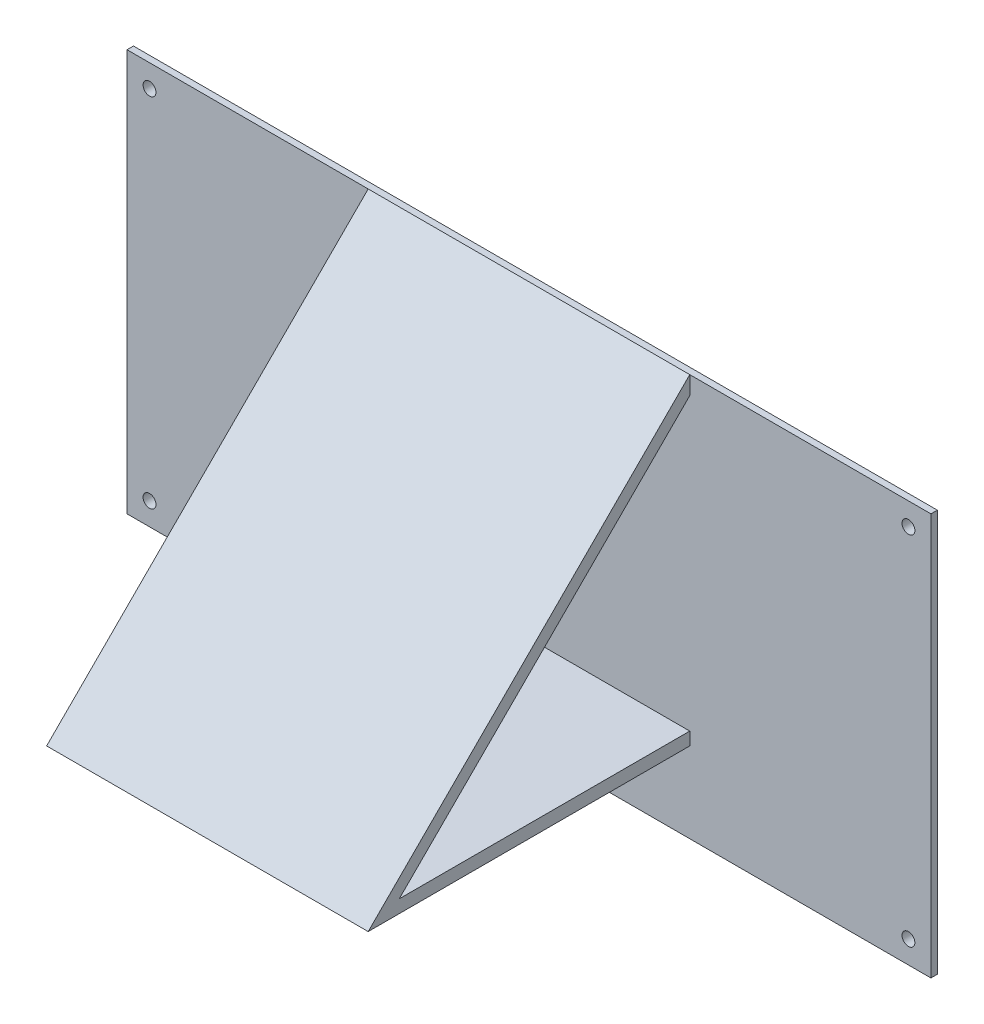
ISO-10303-21;
HEADER;
FILE_DESCRIPTION(('STEP AP214'),'2;1');
FILE_NAME('part.step','',(''),(''),'','','');
FILE_SCHEMA(('AUTOMOTIVE_DESIGN { 1 0 10303 214 1 1 1 1 }'));
ENDSEC;
DATA;
#1=APPLICATION_CONTEXT('core data for automotive mechanical design processes');
#2=APPLICATION_PROTOCOL_DEFINITION('international standard','automotive_design',2000,#1);
#3=PRODUCT_CONTEXT('',#1,'mechanical');
#4=PRODUCT('Part','Part','',(#3));
#5=PRODUCT_RELATED_PRODUCT_CATEGORY('part','',(#4));
#6=PRODUCT_DEFINITION_FORMATION('','',#4);
#7=PRODUCT_DEFINITION_CONTEXT('part definition',#1,'design');
#8=PRODUCT_DEFINITION('design','',#6,#7);
#9=PRODUCT_DEFINITION_SHAPE('','',#8);
#10=(LENGTH_UNIT() NAMED_UNIT(*) SI_UNIT(.MILLI.,.METRE.));
#11=(NAMED_UNIT(*) PLANE_ANGLE_UNIT() SI_UNIT($,.RADIAN.));
#12=(NAMED_UNIT(*) SI_UNIT($,.STERADIAN.) SOLID_ANGLE_UNIT());
#13=UNCERTAINTY_MEASURE_WITH_UNIT(LENGTH_MEASURE(1.E-05),#10,'distance_accuracy_value','');
#14=(GEOMETRIC_REPRESENTATION_CONTEXT(3) GLOBAL_UNCERTAINTY_ASSIGNED_CONTEXT((#13)) GLOBAL_UNIT_ASSIGNED_CONTEXT((#10,
#11,#12)) REPRESENTATION_CONTEXT('',''));
#15=CARTESIAN_POINT('',(0.,0.,0.));
#16=DIRECTION('',(0.,0.,1.));
#17=DIRECTION('',(1.,0.,0.));
#18=AXIS2_PLACEMENT_3D('',#15,#16,#17);
#19=CARTESIAN_POINT('',(75.,125.,102.));
#20=DIRECTION('',(1.,0.,0.));
#21=DIRECTION('',(0.,0.,-1.));
#22=AXIS2_PLACEMENT_3D('',#19,#20,#21);
#23=PLANE('',#22);
#24=DIRECTION('',(0.,0.,-1.));
#25=VECTOR('',#24,1.);
#26=CARTESIAN_POINT('',(75.,29.,92.3431457505076));
#27=LINE('',#26,#25);
#28=CARTESIAN_POINT('',(75.,29.,92.3431457505076));
#29=VERTEX_POINT('',#28);
#30=CARTESIAN_POINT('',(75.,29.,2.));
#31=VERTEX_POINT('',#30);
#32=EDGE_CURVE('E153',#29,#31,#27,.T.);
#33=ORIENTED_EDGE('',*,*,#32,.T.);
#34=DIRECTION('',(0.,-1.,0.));
#35=VECTOR('',#34,1.);
#36=CARTESIAN_POINT('',(75.,125.,2.));
#37=LINE('',#36,#35);
#38=CARTESIAN_POINT('',(75.,25.,2.));
#39=VERTEX_POINT('',#38);
#40=EDGE_CURVE('E182',#31,#39,#37,.T.);
#41=ORIENTED_EDGE('',*,*,#40,.T.);
#42=DIRECTION('',(0.,0.,-1.));
#43=VECTOR('',#42,1.);
#44=CARTESIAN_POINT('',(75.,25.,102.));
#45=LINE('',#44,#43);
#46=CARTESIAN_POINT('',(75.,25.,102.));
#47=VERTEX_POINT('',#46);
#48=EDGE_CURVE('E198',#47,#39,#45,.T.);
#49=ORIENTED_EDGE('',*,*,#48,.F.);
#50=DIRECTION('',(0.,-0.707106781186547,0.707106781186547));
#51=VECTOR('',#50,1.);
#52=CARTESIAN_POINT('',(75.,125.,2.));
#53=LINE('',#52,#51);
#54=CARTESIAN_POINT('',(75.,125.,2.));
#55=VERTEX_POINT('',#54);
#56=EDGE_CURVE('E175',#55,#47,#53,.T.);
#57=ORIENTED_EDGE('',*,*,#56,.F.);
#58=CARTESIAN_POINT('',(75.,119.343145750508,2.));
#59=VERTEX_POINT('',#58);
#60=EDGE_CURVE('E187',#55,#59,#37,.T.);
#61=ORIENTED_EDGE('',*,*,#60,.T.);
#62=DIRECTION('',(0.,-0.707106781186548,0.707106781186547));
#63=VECTOR('',#62,1.);
#64=CARTESIAN_POINT('',(75.,119.343145750508,2.));
#65=LINE('',#64,#63);
#66=EDGE_CURVE('E156',#59,#29,#65,.T.);
#67=ORIENTED_EDGE('',*,*,#66,.T.);
#68=EDGE_LOOP('',(#33,#41,#49,#57,#61,#67));
#69=FACE_BOUND('',#68,.T.);
#70=ADVANCED_FACE('F33',(#69),#23,.F.);
#71=CARTESIAN_POINT('',(175.,125.,102.));
#72=DIRECTION('',(-1.,0.,0.));
#73=DIRECTION('',(0.,0.,1.));
#74=AXIS2_PLACEMENT_3D('',#71,#72,#73);
#75=PLANE('',#74);
#76=DIRECTION('',(0.,0.,-1.));
#77=VECTOR('',#76,1.);
#78=CARTESIAN_POINT('',(175.,29.,92.3431457505076));
#79=LINE('',#78,#77);
#80=CARTESIAN_POINT('',(175.,29.,92.3431457505076));
#81=VERTEX_POINT('',#80);
#82=CARTESIAN_POINT('',(175.,29.,2.));
#83=VERTEX_POINT('',#82);
#84=EDGE_CURVE('E162',#81,#83,#79,.T.);
#85=ORIENTED_EDGE('',*,*,#84,.F.);
#86=DIRECTION('',(0.,-0.707106781186548,0.707106781186547));
#87=VECTOR('',#86,1.);
#88=CARTESIAN_POINT('',(175.,119.343145750508,2.));
#89=LINE('',#88,#87);
#90=CARTESIAN_POINT('',(175.,119.343145750508,1.99999999999999));
#91=VERTEX_POINT('',#90);
#92=EDGE_CURVE('E164',#91,#81,#89,.T.);
#93=ORIENTED_EDGE('',*,*,#92,.F.);
#94=DIRECTION('',(0.,1.,0.));
#95=VECTOR('',#94,1.);
#96=CARTESIAN_POINT('',(175.,125.,2.));
#97=LINE('',#96,#95);
#98=CARTESIAN_POINT('',(175.,125.,2.));
#99=VERTEX_POINT('',#98);
#100=EDGE_CURVE('E193',#91,#99,#97,.T.);
#101=ORIENTED_EDGE('',*,*,#100,.T.);
#102=DIRECTION('',(0.,-0.707106781186547,0.707106781186547));
#103=VECTOR('',#102,1.);
#104=CARTESIAN_POINT('',(175.,125.,2.));
#105=LINE('',#104,#103);
#106=CARTESIAN_POINT('',(175.,25.,102.));
#107=VERTEX_POINT('',#106);
#108=EDGE_CURVE('E176',#99,#107,#105,.T.);
#109=ORIENTED_EDGE('',*,*,#108,.T.);
#110=DIRECTION('',(0.,0.,-1.));
#111=VECTOR('',#110,1.);
#112=CARTESIAN_POINT('',(175.,25.,102.));
#113=LINE('',#112,#111);
#114=CARTESIAN_POINT('',(175.,25.,2.));
#115=VERTEX_POINT('',#114);
#116=EDGE_CURVE('E185',#107,#115,#113,.T.);
#117=ORIENTED_EDGE('',*,*,#116,.T.);
#118=EDGE_CURVE('E186',#115,#83,#97,.T.);
#119=ORIENTED_EDGE('',*,*,#118,.T.);
#120=EDGE_LOOP('',(#85,#93,#101,#109,#117,#119));
#121=FACE_BOUND('',#120,.T.);
#122=ADVANCED_FACE('F261',(#121),#75,.F.);
#123=CARTESIAN_POINT('',(0.,0.,2.));
#124=DIRECTION('',(0.,0.,-1.));
#125=DIRECTION('',(-1.,0.,0.));
#126=AXIS2_PLACEMENT_3D('',#123,#124,#125);
#127=PLANE('',#126);
#128=CARTESIAN_POINT('',(243.,7.00000000000001,2.));
#129=DIRECTION('',(0.,0.,-1.));
#130=DIRECTION('',(-1.,0.,0.));
#131=AXIS2_PLACEMENT_3D('',#128,#129,#130);
#132=CIRCLE('',#131,2.);
#133=CARTESIAN_POINT('',(241.,7.00000000000001,2.));
#134=VERTEX_POINT('',#133);
#135=EDGE_CURVE('E432',#134,#134,#132,.T.);
#136=ORIENTED_EDGE('',*,*,#135,.T.);
#137=EDGE_LOOP('',(#136));
#138=FACE_BOUND('',#137,.T.);
#139=CARTESIAN_POINT('',(6.99999999999998,118.,2.));
#140=DIRECTION('',(0.,0.,-1.));
#141=DIRECTION('',(-1.,0.,0.));
#142=AXIS2_PLACEMENT_3D('',#139,#140,#141);
#143=CIRCLE('',#142,2.);
#144=CARTESIAN_POINT('',(4.99999999999998,118.,2.));
#145=VERTEX_POINT('',#144);
#146=EDGE_CURVE('E433',#145,#145,#143,.T.);
#147=ORIENTED_EDGE('',*,*,#146,.T.);
#148=EDGE_LOOP('',(#147));
#149=FACE_BOUND('',#148,.T.);
#150=CARTESIAN_POINT('',(6.99999999999998,7.,2.));
#151=DIRECTION('',(0.,0.,-1.));
#152=DIRECTION('',(-1.,0.,0.));
#153=AXIS2_PLACEMENT_3D('',#150,#151,#152);
#154=CIRCLE('',#153,2.);
#155=CARTESIAN_POINT('',(4.99999999999998,7.,2.));
#156=VERTEX_POINT('',#155);
#157=EDGE_CURVE('E438',#156,#156,#154,.T.);
#158=ORIENTED_EDGE('',*,*,#157,.T.);
#159=EDGE_LOOP('',(#158));
#160=FACE_BOUND('',#159,.T.);
#161=CARTESIAN_POINT('',(243.,118.,2.));
#162=DIRECTION('',(0.,0.,-1.));
#163=DIRECTION('',(-1.,0.,0.));
#164=AXIS2_PLACEMENT_3D('',#161,#162,#163);
#165=CIRCLE('',#164,2.);
#166=CARTESIAN_POINT('',(241.,118.,2.));
#167=VERTEX_POINT('',#166);
#168=EDGE_CURVE('E453',#167,#167,#165,.T.);
#169=ORIENTED_EDGE('',*,*,#168,.T.);
#170=EDGE_LOOP('',(#169));
#171=FACE_BOUND('',#170,.T.);
#172=DIRECTION('',(-1.,0.,0.));
#173=VECTOR('',#172,1.);
#174=CARTESIAN_POINT('',(175.,119.343145750508,2.));
#175=LINE('',#174,#173);
#176=EDGE_CURVE('E171',#91,#59,#175,.T.);
#177=ORIENTED_EDGE('',*,*,#176,.T.);
#178=ORIENTED_EDGE('',*,*,#60,.F.);
#179=DIRECTION('',(1.,0.,0.));
#180=VECTOR('',#179,1.);
#181=CARTESIAN_POINT('',(0.,125.,2.));
#182=LINE('',#181,#180);
#183=CARTESIAN_POINT('',(0.,125.,2.));
#184=VERTEX_POINT('',#183);
#185=EDGE_CURVE('E209',#184,#55,#182,.T.);
#186=ORIENTED_EDGE('',*,*,#185,.F.);
#187=DIRECTION('',(0.,-1.,0.));
#188=VECTOR('',#187,1.);
#189=CARTESIAN_POINT('',(0.,125.,2.));
#190=LINE('',#189,#188);
#191=CARTESIAN_POINT('',(0.,0.,2.));
#192=VERTEX_POINT('',#191);
#193=EDGE_CURVE('E212',#184,#192,#190,.T.);
#194=ORIENTED_EDGE('',*,*,#193,.T.);
#195=DIRECTION('',(1.,0.,0.));
#196=VECTOR('',#195,1.);
#197=CARTESIAN_POINT('',(0.,0.,2.));
#198=LINE('',#197,#196);
#199=CARTESIAN_POINT('',(250.,0.,2.));
#200=VERTEX_POINT('',#199);
#201=EDGE_CURVE('E202',#192,#200,#198,.T.);
#202=ORIENTED_EDGE('',*,*,#201,.T.);
#203=DIRECTION('',(0.,-1.,0.));
#204=VECTOR('',#203,1.);
#205=CARTESIAN_POINT('',(250.,125.,2.));
#206=LINE('',#205,#204);
#207=CARTESIAN_POINT('',(250.,125.,2.));
#208=VERTEX_POINT('',#207);
#209=EDGE_CURVE('E204',#208,#200,#206,.T.);
#210=ORIENTED_EDGE('',*,*,#209,.F.);
#211=EDGE_CURVE('E208',#99,#208,#182,.T.);
#212=ORIENTED_EDGE('',*,*,#211,.F.);
#213=ORIENTED_EDGE('',*,*,#100,.F.);
#214=EDGE_LOOP('',(#177,#178,#186,#194,#202,#210,#212,#213));
#215=FACE_BOUND('',#214,.T.);
#216=ORIENTED_EDGE('',*,*,#40,.F.);
#217=DIRECTION('',(-1.,0.,0.));
#218=VECTOR('',#217,1.);
#219=CARTESIAN_POINT('',(175.,29.,2.));
#220=LINE('',#219,#218);
#221=EDGE_CURVE('E173',#83,#31,#220,.T.);
#222=ORIENTED_EDGE('',*,*,#221,.F.);
#223=ORIENTED_EDGE('',*,*,#118,.F.);
#224=DIRECTION('',(1.,0.,0.));
#225=VECTOR('',#224,1.);
#226=CARTESIAN_POINT('',(75.,25.,2.));
#227=LINE('',#226,#225);
#228=EDGE_CURVE('E190',#39,#115,#227,.T.);
#229=ORIENTED_EDGE('',*,*,#228,.F.);
#230=EDGE_LOOP('',(#216,#222,#223,#229));
#231=FACE_BOUND('',#230,.T.);
#232=ADVANCED_FACE('F249',(#138,#149,#160,#171,#215,#231),#127,.F.);
#233=CARTESIAN_POINT('',(0.,0.,2.));
#234=DIRECTION('',(0.,1.,0.));
#235=DIRECTION('',(0.,0.,1.));
#236=AXIS2_PLACEMENT_3D('',#233,#234,#235);
#237=PLANE('',#236);
#238=DIRECTION('',(1.,0.,0.));
#239=VECTOR('',#238,1.);
#240=CARTESIAN_POINT('',(0.,0.,0.));
#241=LINE('',#240,#239);
#242=CARTESIAN_POINT('',(0.,0.,0.));
#243=VERTEX_POINT('',#242);
#244=CARTESIAN_POINT('',(250.,0.,0.));
#245=VERTEX_POINT('',#244);
#246=EDGE_CURVE('E201',#243,#245,#241,.T.);
#247=ORIENTED_EDGE('',*,*,#246,.T.);
#248=DIRECTION('',(0.,0.,-1.));
#249=VECTOR('',#248,1.);
#250=CARTESIAN_POINT('',(250.,0.,2.));
#251=LINE('',#250,#249);
#252=EDGE_CURVE('E11',#200,#245,#251,.T.);
#253=ORIENTED_EDGE('',*,*,#252,.F.);
#254=ORIENTED_EDGE('',*,*,#201,.F.);
#255=DIRECTION('',(0.,0.,-1.));
#256=VECTOR('',#255,1.);
#257=CARTESIAN_POINT('',(0.,0.,2.));
#258=LINE('',#257,#256);
#259=EDGE_CURVE('E214',#192,#243,#258,.T.);
#260=ORIENTED_EDGE('',*,*,#259,.T.);
#261=EDGE_LOOP('',(#247,#253,#254,#260));
#262=FACE_BOUND('',#261,.T.);
#263=ADVANCED_FACE('F35',(#262),#237,.F.);
#264=CARTESIAN_POINT('',(250.,125.,2.));
#265=DIRECTION('',(1.,0.,0.));
#266=DIRECTION('',(0.,0.,-1.));
#267=AXIS2_PLACEMENT_3D('',#264,#265,#266);
#268=PLANE('',#267);
#269=DIRECTION('',(0.,-1.,0.));
#270=VECTOR('',#269,1.);
#271=CARTESIAN_POINT('',(250.,125.,0.));
#272=LINE('',#271,#270);
#273=CARTESIAN_POINT('',(250.,125.,0.));
#274=VERTEX_POINT('',#273);
#275=EDGE_CURVE('E217',#274,#245,#272,.T.);
#276=ORIENTED_EDGE('',*,*,#275,.F.);
#277=DIRECTION('',(0.,0.,-1.));
#278=VECTOR('',#277,1.);
#279=CARTESIAN_POINT('',(250.,125.,2.));
#280=LINE('',#279,#278);
#281=EDGE_CURVE('E41',#208,#274,#280,.T.);
#282=ORIENTED_EDGE('',*,*,#281,.F.);
#283=ORIENTED_EDGE('',*,*,#209,.T.);
#284=ORIENTED_EDGE('',*,*,#252,.T.);
#285=EDGE_LOOP('',(#276,#282,#283,#284));
#286=FACE_BOUND('',#285,.T.);
#287=ADVANCED_FACE('F236',(#286),#268,.T.);
#288=CARTESIAN_POINT('',(0.,125.,2.));
#289=DIRECTION('',(0.,1.,0.));
#290=DIRECTION('',(-1.,0.,0.));
#291=AXIS2_PLACEMENT_3D('',#288,#289,#290);
#292=PLANE('',#291);
#293=DIRECTION('',(-1.,0.,0.));
#294=VECTOR('',#293,1.);
#295=CARTESIAN_POINT('',(175.,125.,2.));
#296=LINE('',#295,#294);
#297=EDGE_CURVE('E179',#99,#55,#296,.T.);
#298=ORIENTED_EDGE('',*,*,#297,.F.);
#299=ORIENTED_EDGE('',*,*,#211,.T.);
#300=ORIENTED_EDGE('',*,*,#281,.T.);
#301=DIRECTION('',(1.,0.,0.));
#302=VECTOR('',#301,1.);
#303=CARTESIAN_POINT('',(0.,125.,0.));
#304=LINE('',#303,#302);
#305=CARTESIAN_POINT('',(0.,125.,0.));
#306=VERTEX_POINT('',#305);
#307=EDGE_CURVE('E220',#306,#274,#304,.T.);
#308=ORIENTED_EDGE('',*,*,#307,.F.);
#309=DIRECTION('',(0.,0.,-1.));
#310=VECTOR('',#309,1.);
#311=CARTESIAN_POINT('',(0.,125.,2.));
#312=LINE('',#311,#310);
#313=EDGE_CURVE('E226',#184,#306,#312,.T.);
#314=ORIENTED_EDGE('',*,*,#313,.F.);
#315=ORIENTED_EDGE('',*,*,#185,.T.);
#316=EDGE_LOOP('',(#298,#299,#300,#308,#314,#315));
#317=FACE_BOUND('',#316,.T.);
#318=ADVANCED_FACE('F232',(#317),#292,.T.);
#319=CARTESIAN_POINT('',(0.,125.,2.));
#320=DIRECTION('',(1.,0.,0.));
#321=DIRECTION('',(0.,0.,-1.));
#322=AXIS2_PLACEMENT_3D('',#319,#320,#321);
#323=PLANE('',#322);
#324=DIRECTION('',(0.,-1.,0.));
#325=VECTOR('',#324,1.);
#326=CARTESIAN_POINT('',(0.,125.,0.));
#327=LINE('',#326,#325);
#328=EDGE_CURVE('E205',#306,#243,#327,.T.);
#329=ORIENTED_EDGE('',*,*,#328,.T.);
#330=ORIENTED_EDGE('',*,*,#259,.F.);
#331=ORIENTED_EDGE('',*,*,#193,.F.);
#332=ORIENTED_EDGE('',*,*,#313,.T.);
#333=EDGE_LOOP('',(#329,#330,#331,#332));
#334=FACE_BOUND('',#333,.T.);
#335=ADVANCED_FACE('F244',(#334),#323,.F.);
#336=CARTESIAN_POINT('',(0.,0.,0.));
#337=DIRECTION('',(0.,0.,-1.));
#338=DIRECTION('',(-1.,0.,0.));
#339=AXIS2_PLACEMENT_3D('',#336,#337,#338);
#340=PLANE('',#339);
#341=DIRECTION('',(0.,-1.,0.));
#342=VECTOR('',#341,1.);
#343=CARTESIAN_POINT('',(246.,121.,0.));
#344=LINE('',#343,#342);
#345=CARTESIAN_POINT('',(246.,121.,0.));
#346=VERTEX_POINT('',#345);
#347=CARTESIAN_POINT('',(246.,4.,0.));
#348=VERTEX_POINT('',#347);
#349=EDGE_CURVE('E48',#346,#348,#344,.T.);
#350=ORIENTED_EDGE('',*,*,#349,.F.);
#351=DIRECTION('',(1.,0.,0.));
#352=VECTOR('',#351,1.);
#353=CARTESIAN_POINT('',(246.,121.,0.));
#354=LINE('',#353,#352);
#355=CARTESIAN_POINT('',(4.,121.,0.));
#356=VERTEX_POINT('',#355);
#357=EDGE_CURVE('E52',#356,#346,#354,.T.);
#358=ORIENTED_EDGE('',*,*,#357,.F.);
#359=DIRECTION('',(0.,1.,0.));
#360=VECTOR('',#359,1.);
#361=CARTESIAN_POINT('',(4.,121.,0.));
#362=LINE('',#361,#360);
#363=CARTESIAN_POINT('',(3.99999999999998,4.,0.));
#364=VERTEX_POINT('',#363);
#365=EDGE_CURVE('E446',#364,#356,#362,.T.);
#366=ORIENTED_EDGE('',*,*,#365,.F.);
#367=DIRECTION('',(-1.,0.,0.));
#368=VECTOR('',#367,1.);
#369=CARTESIAN_POINT('',(246.,4.,0.));
#370=LINE('',#369,#368);
#371=EDGE_CURVE('E435',#348,#364,#370,.T.);
#372=ORIENTED_EDGE('',*,*,#371,.F.);
#373=EDGE_LOOP('',(#350,#358,#366,#372));
#374=FACE_BOUND('',#373,.T.);
#375=ORIENTED_EDGE('',*,*,#246,.F.);
#376=ORIENTED_EDGE('',*,*,#328,.F.);
#377=ORIENTED_EDGE('',*,*,#307,.T.);
#378=ORIENTED_EDGE('',*,*,#275,.T.);
#379=EDGE_LOOP('',(#375,#376,#377,#378));
#380=FACE_BOUND('',#379,.T.);
#381=ADVANCED_FACE('F241',(#374,#380),#340,.T.);
#382=CARTESIAN_POINT('',(75.,25.,102.));
#383=DIRECTION('',(0.,1.,0.));
#384=DIRECTION('',(0.,0.,1.));
#385=AXIS2_PLACEMENT_3D('',#382,#383,#384);
#386=PLANE('',#385);
#387=ORIENTED_EDGE('',*,*,#228,.T.);
#388=ORIENTED_EDGE('',*,*,#116,.F.);
#389=DIRECTION('',(1.,0.,0.));
#390=VECTOR('',#389,1.);
#391=CARTESIAN_POINT('',(75.,25.,102.));
#392=LINE('',#391,#390);
#393=EDGE_CURVE('E183',#47,#107,#392,.T.);
#394=ORIENTED_EDGE('',*,*,#393,.F.);
#395=ORIENTED_EDGE('',*,*,#48,.T.);
#396=EDGE_LOOP('',(#387,#388,#394,#395));
#397=FACE_BOUND('',#396,.T.);
#398=ADVANCED_FACE('F267',(#397),#386,.F.);
#399=CARTESIAN_POINT('',(175.,125.,2.));
#400=DIRECTION('',(0.,-0.707106781186547,-0.707106781186547));
#401=DIRECTION('',(0.,0.707106781186548,-0.707106781186548));
#402=AXIS2_PLACEMENT_3D('',#399,#400,#401);
#403=PLANE('',#402);
#404=ORIENTED_EDGE('',*,*,#56,.T.);
#405=ORIENTED_EDGE('',*,*,#393,.T.);
#406=ORIENTED_EDGE('',*,*,#108,.F.);
#407=ORIENTED_EDGE('',*,*,#297,.T.);
#408=EDGE_LOOP('',(#404,#405,#406,#407));
#409=FACE_BOUND('',#408,.T.);
#410=ADVANCED_FACE('F263',(#409),#403,.F.);
#411=CARTESIAN_POINT('',(175.,29.,92.3431457505076));
#412=DIRECTION('',(0.,1.,0.));
#413=DIRECTION('',(0.,0.,1.));
#414=AXIS2_PLACEMENT_3D('',#411,#412,#413);
#415=PLANE('',#414);
#416=ORIENTED_EDGE('',*,*,#32,.F.);
#417=DIRECTION('',(-1.,0.,0.));
#418=VECTOR('',#417,1.);
#419=CARTESIAN_POINT('',(175.,29.,92.3431457505076));
#420=LINE('',#419,#418);
#421=EDGE_CURVE('E165',#81,#29,#420,.T.);
#422=ORIENTED_EDGE('',*,*,#421,.F.);
#423=ORIENTED_EDGE('',*,*,#84,.T.);
#424=ORIENTED_EDGE('',*,*,#221,.T.);
#425=EDGE_LOOP('',(#416,#422,#423,#424));
#426=FACE_BOUND('',#425,.T.);
#427=ADVANCED_FACE('F274',(#426),#415,.T.);
#428=CARTESIAN_POINT('',(175.,119.343145750508,2.));
#429=DIRECTION('',(0.,-0.707106781186547,-0.707106781186548));
#430=DIRECTION('',(0.,0.707106781186548,-0.707106781186547));
#431=AXIS2_PLACEMENT_3D('',#428,#429,#430);
#432=PLANE('',#431);
#433=ORIENTED_EDGE('',*,*,#66,.F.);
#434=ORIENTED_EDGE('',*,*,#176,.F.);
#435=ORIENTED_EDGE('',*,*,#92,.T.);
#436=ORIENTED_EDGE('',*,*,#421,.T.);
#437=EDGE_LOOP('',(#433,#434,#435,#436));
#438=FACE_BOUND('',#437,.T.);
#439=ADVANCED_FACE('F276',(#438),#432,.T.);
#440=CARTESIAN_POINT('',(246.,121.,-2.));
#441=DIRECTION('',(-1.,0.,0.));
#442=DIRECTION('',(0.,-1.,0.));
#443=AXIS2_PLACEMENT_3D('',#440,#441,#442);
#444=PLANE('',#443);
#445=ORIENTED_EDGE('',*,*,#349,.T.);
#446=DIRECTION('',(0.,0.,1.));
#447=VECTOR('',#446,1.);
#448=CARTESIAN_POINT('',(246.,4.,-2.));
#449=LINE('',#448,#447);
#450=CARTESIAN_POINT('',(246.,4.,-2.));
#451=VERTEX_POINT('',#450);
#452=EDGE_CURVE('E136',#451,#348,#449,.T.);
#453=ORIENTED_EDGE('',*,*,#452,.F.);
#454=DIRECTION('',(0.,-1.,0.));
#455=VECTOR('',#454,1.);
#456=CARTESIAN_POINT('',(246.,121.,-2.));
#457=LINE('',#456,#455);
#458=CARTESIAN_POINT('',(246.,121.,-2.));
#459=VERTEX_POINT('',#458);
#460=EDGE_CURVE('E142',#459,#451,#457,.T.);
#461=ORIENTED_EDGE('',*,*,#460,.F.);
#462=DIRECTION('',(0.,0.,1.));
#463=VECTOR('',#462,1.);
#464=CARTESIAN_POINT('',(246.,121.,-2.));
#465=LINE('',#464,#463);
#466=EDGE_CURVE('E443',#459,#346,#465,.T.);
#467=ORIENTED_EDGE('',*,*,#466,.T.);
#468=EDGE_LOOP('',(#445,#453,#461,#467));
#469=FACE_BOUND('',#468,.T.);
#470=ADVANCED_FACE('F152',(#469),#444,.F.);
#471=CARTESIAN_POINT('',(246.,4.,-2.));
#472=DIRECTION('',(0.,1.,0.));
#473=DIRECTION('',(-1.,0.,0.));
#474=AXIS2_PLACEMENT_3D('',#471,#472,#473);
#475=PLANE('',#474);
#476=ORIENTED_EDGE('',*,*,#371,.T.);
#477=DIRECTION('',(0.,0.,1.));
#478=VECTOR('',#477,1.);
#479=CARTESIAN_POINT('',(3.99999999999998,4.,-2.));
#480=LINE('',#479,#478);
#481=CARTESIAN_POINT('',(3.99999999999998,4.,-2.));
#482=VERTEX_POINT('',#481);
#483=EDGE_CURVE('E138',#482,#364,#480,.T.);
#484=ORIENTED_EDGE('',*,*,#483,.F.);
#485=DIRECTION('',(-1.,0.,0.));
#486=VECTOR('',#485,1.);
#487=CARTESIAN_POINT('',(246.,4.,-2.));
#488=LINE('',#487,#486);
#489=EDGE_CURVE('E131',#451,#482,#488,.T.);
#490=ORIENTED_EDGE('',*,*,#489,.F.);
#491=ORIENTED_EDGE('',*,*,#452,.T.);
#492=EDGE_LOOP('',(#476,#484,#490,#491));
#493=FACE_BOUND('',#492,.T.);
#494=ADVANCED_FACE('F134',(#493),#475,.F.);
#495=CARTESIAN_POINT('',(4.,121.,-2.));
#496=DIRECTION('',(1.,0.,0.));
#497=DIRECTION('',(0.,1.,0.));
#498=AXIS2_PLACEMENT_3D('',#495,#496,#497);
#499=PLANE('',#498);
#500=ORIENTED_EDGE('',*,*,#365,.T.);
#501=DIRECTION('',(0.,0.,1.));
#502=VECTOR('',#501,1.);
#503=CARTESIAN_POINT('',(4.,121.,-2.));
#504=LINE('',#503,#502);
#505=CARTESIAN_POINT('',(4.,121.,-2.));
#506=VERTEX_POINT('',#505);
#507=EDGE_CURVE('E158',#506,#356,#504,.T.);
#508=ORIENTED_EDGE('',*,*,#507,.F.);
#509=DIRECTION('',(0.,1.,0.));
#510=VECTOR('',#509,1.);
#511=CARTESIAN_POINT('',(4.,121.,-2.));
#512=LINE('',#511,#510);
#513=EDGE_CURVE('E141',#482,#506,#512,.T.);
#514=ORIENTED_EDGE('',*,*,#513,.F.);
#515=ORIENTED_EDGE('',*,*,#483,.T.);
#516=EDGE_LOOP('',(#500,#508,#514,#515));
#517=FACE_BOUND('',#516,.T.);
#518=ADVANCED_FACE('F356',(#517),#499,.F.);
#519=CARTESIAN_POINT('',(246.,121.,-2.));
#520=DIRECTION('',(0.,-1.,0.));
#521=DIRECTION('',(0.,0.,-1.));
#522=AXIS2_PLACEMENT_3D('',#519,#520,#521);
#523=PLANE('',#522);
#524=ORIENTED_EDGE('',*,*,#357,.T.);
#525=ORIENTED_EDGE('',*,*,#466,.F.);
#526=DIRECTION('',(1.,0.,0.));
#527=VECTOR('',#526,1.);
#528=CARTESIAN_POINT('',(246.,121.,-2.));
#529=LINE('',#528,#527);
#530=EDGE_CURVE('E147',#506,#459,#529,.T.);
#531=ORIENTED_EDGE('',*,*,#530,.F.);
#532=ORIENTED_EDGE('',*,*,#507,.T.);
#533=EDGE_LOOP('',(#524,#525,#531,#532));
#534=FACE_BOUND('',#533,.T.);
#535=ADVANCED_FACE('F364',(#534),#523,.F.);
#536=CARTESIAN_POINT('',(0.,0.,-2.));
#537=DIRECTION('',(0.,0.,-1.));
#538=DIRECTION('',(-1.,0.,0.));
#539=AXIS2_PLACEMENT_3D('',#536,#537,#538);
#540=PLANE('',#539);
#541=CARTESIAN_POINT('',(243.,7.00000000000001,-2.));
#542=DIRECTION('',(0.,0.,-1.));
#543=DIRECTION('',(-1.,0.,0.));
#544=AXIS2_PLACEMENT_3D('',#541,#542,#543);
#545=CIRCLE('',#544,2.);
#546=CARTESIAN_POINT('',(241.,7.00000000000001,-2.));
#547=VERTEX_POINT('',#546);
#548=EDGE_CURVE('E429',#547,#547,#545,.T.);
#549=ORIENTED_EDGE('',*,*,#548,.F.);
#550=EDGE_LOOP('',(#549));
#551=FACE_BOUND('',#550,.T.);
#552=CARTESIAN_POINT('',(6.99999999999998,118.,-2.));
#553=DIRECTION('',(0.,0.,-1.));
#554=DIRECTION('',(-1.,0.,0.));
#555=AXIS2_PLACEMENT_3D('',#552,#553,#554);
#556=CIRCLE('',#555,2.);
#557=CARTESIAN_POINT('',(4.99999999999998,118.,-2.));
#558=VERTEX_POINT('',#557);
#559=EDGE_CURVE('E461',#558,#558,#556,.T.);
#560=ORIENTED_EDGE('',*,*,#559,.F.);
#561=EDGE_LOOP('',(#560));
#562=FACE_BOUND('',#561,.T.);
#563=CARTESIAN_POINT('',(6.99999999999998,7.,-2.));
#564=DIRECTION('',(0.,0.,-1.));
#565=DIRECTION('',(-1.,0.,0.));
#566=AXIS2_PLACEMENT_3D('',#563,#564,#565);
#567=CIRCLE('',#566,2.);
#568=CARTESIAN_POINT('',(4.99999999999998,7.,-2.));
#569=VERTEX_POINT('',#568);
#570=EDGE_CURVE('E459',#569,#569,#567,.T.);
#571=ORIENTED_EDGE('',*,*,#570,.F.);
#572=EDGE_LOOP('',(#571));
#573=FACE_BOUND('',#572,.T.);
#574=CARTESIAN_POINT('',(243.,118.,-2.));
#575=DIRECTION('',(0.,0.,-1.));
#576=DIRECTION('',(-1.,0.,0.));
#577=AXIS2_PLACEMENT_3D('',#574,#575,#576);
#578=CIRCLE('',#577,2.);
#579=CARTESIAN_POINT('',(241.,118.,-2.));
#580=VERTEX_POINT('',#579);
#581=EDGE_CURVE('E456',#580,#580,#578,.T.);
#582=ORIENTED_EDGE('',*,*,#581,.F.);
#583=EDGE_LOOP('',(#582));
#584=FACE_BOUND('',#583,.T.);
#585=ORIENTED_EDGE('',*,*,#460,.T.);
#586=ORIENTED_EDGE('',*,*,#489,.T.);
#587=ORIENTED_EDGE('',*,*,#513,.T.);
#588=ORIENTED_EDGE('',*,*,#530,.T.);
#589=EDGE_LOOP('',(#585,#586,#587,#588));
#590=FACE_BOUND('',#589,.T.);
#591=ADVANCED_FACE('F145',(#551,#562,#573,#584,#590),#540,.T.);
#592=CARTESIAN_POINT('',(243.,118.,30.));
#593=DIRECTION('',(0.,0.,-1.));
#594=DIRECTION('',(-1.,0.,0.));
#595=AXIS2_PLACEMENT_3D('',#592,#593,#594);
#596=CYLINDRICAL_SURFACE('',#595,2.);
#597=ORIENTED_EDGE('',*,*,#581,.T.);
#598=EDGE_LOOP('',(#597));
#599=FACE_BOUND('',#598,.T.);
#600=ORIENTED_EDGE('',*,*,#168,.F.);
#601=EDGE_LOOP('',(#600));
#602=FACE_BOUND('',#601,.T.);
#603=ADVANCED_FACE('F382',(#599,#602),#596,.F.);
#604=CARTESIAN_POINT('',(6.99999999999998,7.,30.));
#605=DIRECTION('',(0.,0.,-1.));
#606=DIRECTION('',(-1.,0.,0.));
#607=AXIS2_PLACEMENT_3D('',#604,#605,#606);
#608=CYLINDRICAL_SURFACE('',#607,2.);
#609=ORIENTED_EDGE('',*,*,#570,.T.);
#610=EDGE_LOOP('',(#609));
#611=FACE_BOUND('',#610,.T.);
#612=ORIENTED_EDGE('',*,*,#157,.F.);
#613=EDGE_LOOP('',(#612));
#614=FACE_BOUND('',#613,.T.);
#615=ADVANCED_FACE('F389',(#611,#614),#608,.F.);
#616=CARTESIAN_POINT('',(6.99999999999998,118.,30.));
#617=DIRECTION('',(0.,0.,-1.));
#618=DIRECTION('',(-1.,0.,0.));
#619=AXIS2_PLACEMENT_3D('',#616,#617,#618);
#620=CYLINDRICAL_SURFACE('',#619,2.);
#621=ORIENTED_EDGE('',*,*,#559,.T.);
#622=EDGE_LOOP('',(#621));
#623=FACE_BOUND('',#622,.T.);
#624=ORIENTED_EDGE('',*,*,#146,.F.);
#625=EDGE_LOOP('',(#624));
#626=FACE_BOUND('',#625,.T.);
#627=ADVANCED_FACE('F397',(#623,#626),#620,.F.);
#628=CARTESIAN_POINT('',(243.,7.00000000000001,30.));
#629=DIRECTION('',(0.,0.,-1.));
#630=DIRECTION('',(-1.,0.,0.));
#631=AXIS2_PLACEMENT_3D('',#628,#629,#630);
#632=CYLINDRICAL_SURFACE('',#631,2.);
#633=ORIENTED_EDGE('',*,*,#548,.T.);
#634=EDGE_LOOP('',(#633));
#635=FACE_BOUND('',#634,.T.);
#636=ORIENTED_EDGE('',*,*,#135,.F.);
#637=EDGE_LOOP('',(#636));
#638=FACE_BOUND('',#637,.T.);
#639=ADVANCED_FACE('F405',(#635,#638),#632,.F.);
#640=CLOSED_SHELL('',(#70,#122,#232,#263,#287,#318,#335,#381,#398,#410,#427,#439,#470,#494,#518,
#535,#591,#603,#615,#627,#639));
#641=MANIFOLD_SOLID_BREP('B2',#640);
#642=ADVANCED_BREP_SHAPE_REPRESENTATION('',(#18,#641),#14);
#643=SHAPE_DEFINITION_REPRESENTATION(#9,#642);
ENDSEC;
END-ISO-10303-21;
